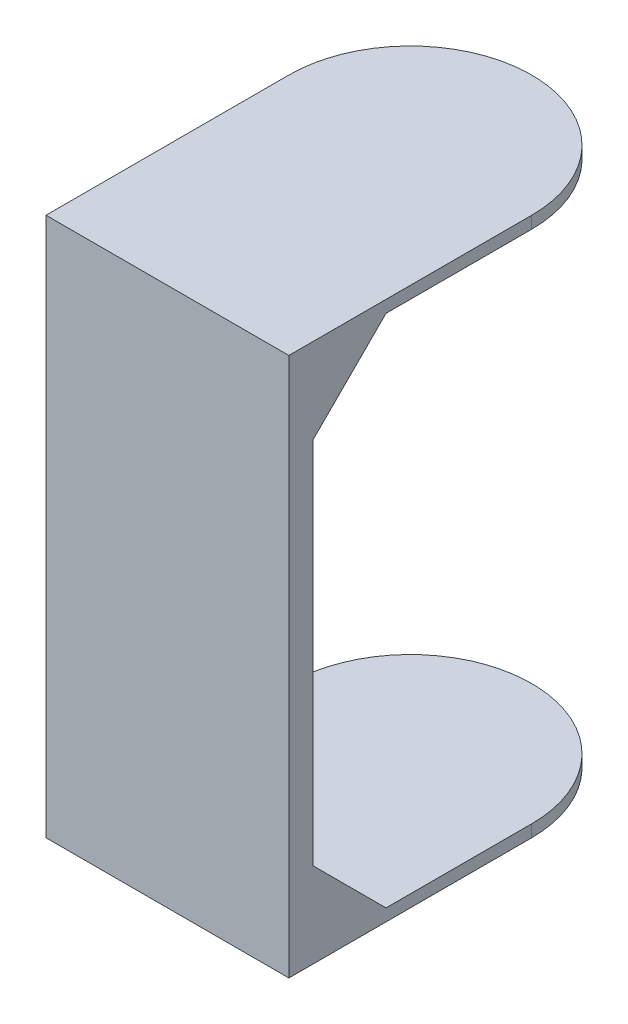
ISO-10303-21;
HEADER;
FILE_DESCRIPTION(('STEP AP214'),'2;1');
FILE_NAME('part.step','',(''),(''),'','','');
FILE_SCHEMA(('AUTOMOTIVE_DESIGN { 1 0 10303 214 1 1 1 1 }'));
ENDSEC;
DATA;
#1=APPLICATION_CONTEXT('core data for automotive mechanical design processes');
#2=APPLICATION_PROTOCOL_DEFINITION('international standard','automotive_design',2000,#1);
#3=PRODUCT_CONTEXT('',#1,'mechanical');
#4=PRODUCT('Part','Part','',(#3));
#5=PRODUCT_RELATED_PRODUCT_CATEGORY('part','',(#4));
#6=PRODUCT_DEFINITION_FORMATION('','',#4);
#7=PRODUCT_DEFINITION_CONTEXT('part definition',#1,'design');
#8=PRODUCT_DEFINITION('design','',#6,#7);
#9=PRODUCT_DEFINITION_SHAPE('','',#8);
#10=(LENGTH_UNIT() NAMED_UNIT(*) SI_UNIT(.MILLI.,.METRE.));
#11=(NAMED_UNIT(*) PLANE_ANGLE_UNIT() SI_UNIT($,.RADIAN.));
#12=(NAMED_UNIT(*) SI_UNIT($,.STERADIAN.) SOLID_ANGLE_UNIT());
#13=UNCERTAINTY_MEASURE_WITH_UNIT(LENGTH_MEASURE(1.E-05),#10,'distance_accuracy_value','');
#14=(GEOMETRIC_REPRESENTATION_CONTEXT(3) GLOBAL_UNCERTAINTY_ASSIGNED_CONTEXT((#13)) GLOBAL_UNIT_ASSIGNED_CONTEXT((#10,
#11,#12)) REPRESENTATION_CONTEXT('',''));
#15=CARTESIAN_POINT('',(0.,0.,0.));
#16=DIRECTION('',(0.,0.,1.));
#17=DIRECTION('',(1.,0.,0.));
#18=AXIS2_PLACEMENT_3D('',#15,#16,#17);
#19=CARTESIAN_POINT('',(0.,0.,-10.));
#20=DIRECTION('',(0.,0.,1.));
#21=DIRECTION('',(1.,0.,0.));
#22=AXIS2_PLACEMENT_3D('',#19,#20,#21);
#23=PLANE('',#22);
#24=DIRECTION('',(0.,-1.,0.));
#25=VECTOR('',#24,1.);
#26=CARTESIAN_POINT('',(-50.,106.,-10.));
#27=LINE('',#26,#25);
#28=CARTESIAN_POINT('',(-50.,76.,-10.));
#29=VERTEX_POINT('',#28);
#30=CARTESIAN_POINT('',(-50.,-106.,-10.));
#31=VERTEX_POINT('',#30);
#32=EDGE_CURVE('E41',#29,#31,#27,.T.);
#33=ORIENTED_EDGE('',*,*,#32,.F.);
#34=DIRECTION('',(-1.,0.,0.));
#35=VECTOR('',#34,1.);
#36=CARTESIAN_POINT('',(-40.,76.,-10.));
#37=LINE('',#36,#35);
#38=CARTESIAN_POINT('',(-40.,76.,-10.));
#39=VERTEX_POINT('',#38);
#40=EDGE_CURVE('E207',#39,#29,#37,.T.);
#41=ORIENTED_EDGE('',*,*,#40,.F.);
#42=DIRECTION('',(0.,1.,0.));
#43=VECTOR('',#42,1.);
#44=CARTESIAN_POINT('',(-40.,106.,-10.));
#45=LINE('',#44,#43);
#46=CARTESIAN_POINT('',(-40.,106.,-10.));
#47=VERTEX_POINT('',#46);
#48=EDGE_CURVE('E195',#39,#47,#45,.T.);
#49=ORIENTED_EDGE('',*,*,#48,.T.);
#50=DIRECTION('',(-1.,0.,0.));
#51=VECTOR('',#50,1.);
#52=CARTESIAN_POINT('',(-50.,106.,-10.));
#53=LINE('',#52,#51);
#54=CARTESIAN_POINT('',(40.,106.,-10.));
#55=VERTEX_POINT('',#54);
#56=EDGE_CURVE('E240',#55,#47,#53,.T.);
#57=ORIENTED_EDGE('',*,*,#56,.F.);
#58=DIRECTION('',(0.,-1.,0.));
#59=VECTOR('',#58,1.);
#60=CARTESIAN_POINT('',(40.,106.,-10.));
#61=LINE('',#60,#59);
#62=CARTESIAN_POINT('',(40.,76.,-10.));
#63=VERTEX_POINT('',#62);
#64=EDGE_CURVE('E227',#55,#63,#61,.T.);
#65=ORIENTED_EDGE('',*,*,#64,.T.);
#66=DIRECTION('',(1.,0.,0.));
#67=VECTOR('',#66,1.);
#68=CARTESIAN_POINT('',(40.,76.,-10.));
#69=LINE('',#68,#67);
#70=CARTESIAN_POINT('',(50.,76.,-10.));
#71=VERTEX_POINT('',#70);
#72=EDGE_CURVE('E233',#63,#71,#69,.T.);
#73=ORIENTED_EDGE('',*,*,#72,.T.);
#74=DIRECTION('',(0.,1.,0.));
#75=VECTOR('',#74,1.);
#76=CARTESIAN_POINT('',(50.,106.,-10.));
#77=LINE('',#76,#75);
#78=CARTESIAN_POINT('',(50.,-76.,-10.));
#79=VERTEX_POINT('',#78);
#80=EDGE_CURVE('E54',#79,#71,#77,.T.);
#81=ORIENTED_EDGE('',*,*,#80,.F.);
#82=DIRECTION('',(1.,0.,0.));
#83=VECTOR('',#82,1.);
#84=CARTESIAN_POINT('',(40.,-76.,-10.));
#85=LINE('',#84,#83);
#86=CARTESIAN_POINT('',(40.,-76.,-10.));
#87=VERTEX_POINT('',#86);
#88=EDGE_CURVE('E219',#87,#79,#85,.T.);
#89=ORIENTED_EDGE('',*,*,#88,.F.);
#90=DIRECTION('',(0.,1.,0.));
#91=VECTOR('',#90,1.);
#92=CARTESIAN_POINT('',(40.,-106.,-10.));
#93=LINE('',#92,#91);
#94=CARTESIAN_POINT('',(40.,-106.,-10.));
#95=VERTEX_POINT('',#94);
#96=EDGE_CURVE('E215',#95,#87,#93,.T.);
#97=ORIENTED_EDGE('',*,*,#96,.F.);
#98=DIRECTION('',(1.,0.,0.));
#99=VECTOR('',#98,1.);
#100=CARTESIAN_POINT('',(-50.,-106.,-10.));
#101=LINE('',#100,#99);
#102=EDGE_CURVE('E11',#31,#95,#101,.T.);
#103=ORIENTED_EDGE('',*,*,#102,.F.);
#104=EDGE_LOOP('',(#33,#41,#49,#57,#65,#73,#81,#89,#97,#103));
#105=FACE_BOUND('',#104,.T.);
#106=ADVANCED_FACE('F32',(#105),#23,.F.);
#107=CARTESIAN_POINT('',(50.,106.,-10.));
#108=DIRECTION('',(1.,0.,0.));
#109=DIRECTION('',(0.,1.,0.));
#110=AXIS2_PLACEMENT_3D('',#107,#108,#109);
#111=PLANE('',#110);
#112=DIRECTION('',(0.,1.,0.));
#113=VECTOR('',#112,1.);
#114=CARTESIAN_POINT('',(50.,106.,0.));
#115=LINE('',#114,#113);
#116=CARTESIAN_POINT('',(50.,-111.,0.));
#117=VERTEX_POINT('',#116);
#118=CARTESIAN_POINT('',(50.,111.,0.));
#119=VERTEX_POINT('',#118);
#120=EDGE_CURVE('E158',#117,#119,#115,.T.);
#121=ORIENTED_EDGE('',*,*,#120,.F.);
#122=DIRECTION('',(0.,0.,-1.));
#123=VECTOR('',#122,1.);
#124=CARTESIAN_POINT('',(50.,-111.,0.));
#125=LINE('',#124,#123);
#126=CARTESIAN_POINT('',(50.,-111.,-100.));
#127=VERTEX_POINT('',#126);
#128=EDGE_CURVE('E151',#117,#127,#125,.T.);
#129=ORIENTED_EDGE('',*,*,#128,.T.);
#130=DIRECTION('',(0.,1.,0.));
#131=VECTOR('',#130,1.);
#132=CARTESIAN_POINT('',(50.,-111.,-100.));
#133=LINE('',#132,#131);
#134=CARTESIAN_POINT('',(50.,-106.,-100.));
#135=VERTEX_POINT('',#134);
#136=EDGE_CURVE('E136',#127,#135,#133,.T.);
#137=ORIENTED_EDGE('',*,*,#136,.T.);
#138=DIRECTION('',(0.,0.,-1.));
#139=VECTOR('',#138,1.);
#140=CARTESIAN_POINT('',(50.,-106.,0.));
#141=LINE('',#140,#139);
#142=CARTESIAN_POINT('',(50.,-106.,-40.));
#143=VERTEX_POINT('',#142);
#144=EDGE_CURVE('E165',#143,#135,#141,.T.);
#145=ORIENTED_EDGE('',*,*,#144,.F.);
#146=DIRECTION('',(0.,-0.707106781186548,-0.707106781186547));
#147=VECTOR('',#146,1.);
#148=CARTESIAN_POINT('',(50.,-76.,-10.));
#149=LINE('',#148,#147);
#150=EDGE_CURVE('E49',#79,#143,#149,.T.);
#151=ORIENTED_EDGE('',*,*,#150,.F.);
#152=ORIENTED_EDGE('',*,*,#80,.T.);
#153=DIRECTION('',(0.,0.707106781186548,-0.707106781186547));
#154=VECTOR('',#153,1.);
#155=CARTESIAN_POINT('',(50.,76.,-10.));
#156=LINE('',#155,#154);
#157=CARTESIAN_POINT('',(50.,106.,-40.));
#158=VERTEX_POINT('',#157);
#159=EDGE_CURVE('E221',#71,#158,#156,.T.);
#160=ORIENTED_EDGE('',*,*,#159,.T.);
#161=DIRECTION('',(0.,0.,-1.));
#162=VECTOR('',#161,1.);
#163=CARTESIAN_POINT('',(50.,106.,0.));
#164=LINE('',#163,#162);
#165=CARTESIAN_POINT('',(50.,106.,-100.));
#166=VERTEX_POINT('',#165);
#167=EDGE_CURVE('E174',#158,#166,#164,.T.);
#168=ORIENTED_EDGE('',*,*,#167,.T.);
#169=DIRECTION('',(0.,-1.,0.));
#170=VECTOR('',#169,1.);
#171=CARTESIAN_POINT('',(50.,111.,-100.));
#172=LINE('',#171,#170);
#173=CARTESIAN_POINT('',(50.,111.,-100.));
#174=VERTEX_POINT('',#173);
#175=EDGE_CURVE('E182',#174,#166,#172,.T.);
#176=ORIENTED_EDGE('',*,*,#175,.F.);
#177=DIRECTION('',(0.,0.,-1.));
#178=VECTOR('',#177,1.);
#179=CARTESIAN_POINT('',(50.,111.,0.));
#180=LINE('',#179,#178);
#181=EDGE_CURVE('E180',#119,#174,#180,.T.);
#182=ORIENTED_EDGE('',*,*,#181,.F.);
#183=EDGE_LOOP('',(#121,#129,#137,#145,#151,#152,#160,#168,#176,#182));
#184=FACE_BOUND('',#183,.T.);
#185=ADVANCED_FACE('F34',(#184),#111,.T.);
#186=CARTESIAN_POINT('',(-50.,106.,-10.));
#187=DIRECTION('',(-1.,0.,0.));
#188=DIRECTION('',(0.,-1.,0.));
#189=AXIS2_PLACEMENT_3D('',#186,#187,#188);
#190=PLANE('',#189);
#191=DIRECTION('',(0.,-1.,0.));
#192=VECTOR('',#191,1.);
#193=CARTESIAN_POINT('',(-50.,106.,0.));
#194=LINE('',#193,#192);
#195=CARTESIAN_POINT('',(-50.,111.,0.));
#196=VERTEX_POINT('',#195);
#197=CARTESIAN_POINT('',(-50.,-111.,0.));
#198=VERTEX_POINT('',#197);
#199=EDGE_CURVE('E36',#196,#198,#194,.T.);
#200=ORIENTED_EDGE('',*,*,#199,.F.);
#201=DIRECTION('',(0.,0.,1.));
#202=VECTOR('',#201,1.);
#203=CARTESIAN_POINT('',(-50.,111.,0.));
#204=LINE('',#203,#202);
#205=CARTESIAN_POINT('',(-50.,111.,-100.));
#206=VERTEX_POINT('',#205);
#207=EDGE_CURVE('E173',#206,#196,#204,.T.);
#208=ORIENTED_EDGE('',*,*,#207,.F.);
#209=DIRECTION('',(0.,-1.,0.));
#210=VECTOR('',#209,1.);
#211=CARTESIAN_POINT('',(-50.,111.,-100.));
#212=LINE('',#211,#210);
#213=CARTESIAN_POINT('',(-50.,106.,-100.));
#214=VERTEX_POINT('',#213);
#215=EDGE_CURVE('E191',#206,#214,#212,.T.);
#216=ORIENTED_EDGE('',*,*,#215,.T.);
#217=DIRECTION('',(0.,0.,1.));
#218=VECTOR('',#217,1.);
#219=CARTESIAN_POINT('',(-50.,106.,0.));
#220=LINE('',#219,#218);
#221=CARTESIAN_POINT('',(-50.,106.,-40.));
#222=VERTEX_POINT('',#221);
#223=EDGE_CURVE('E185',#214,#222,#220,.T.);
#224=ORIENTED_EDGE('',*,*,#223,.T.);
#225=DIRECTION('',(0.,-0.707106781186548,0.707106781186547));
#226=VECTOR('',#225,1.);
#227=CARTESIAN_POINT('',(-50.,76.,-10.));
#228=LINE('',#227,#226);
#229=EDGE_CURVE('E194',#222,#29,#228,.T.);
#230=ORIENTED_EDGE('',*,*,#229,.T.);
#231=ORIENTED_EDGE('',*,*,#32,.T.);
#232=DIRECTION('',(0.,0.,1.));
#233=VECTOR('',#232,1.);
#234=CARTESIAN_POINT('',(-50.,-106.,0.));
#235=LINE('',#234,#233);
#236=CARTESIAN_POINT('',(-50.,-106.,-100.));
#237=VERTEX_POINT('',#236);
#238=EDGE_CURVE('E155',#237,#31,#235,.T.);
#239=ORIENTED_EDGE('',*,*,#238,.F.);
#240=DIRECTION('',(0.,1.,0.));
#241=VECTOR('',#240,1.);
#242=CARTESIAN_POINT('',(-50.,-111.,-100.));
#243=LINE('',#242,#241);
#244=CARTESIAN_POINT('',(-50.,-111.,-100.));
#245=VERTEX_POINT('',#244);
#246=EDGE_CURVE('E145',#245,#237,#243,.T.);
#247=ORIENTED_EDGE('',*,*,#246,.F.);
#248=DIRECTION('',(0.,0.,1.));
#249=VECTOR('',#248,1.);
#250=CARTESIAN_POINT('',(-50.,-111.,0.));
#251=LINE('',#250,#249);
#252=EDGE_CURVE('E154',#245,#198,#251,.T.);
#253=ORIENTED_EDGE('',*,*,#252,.T.);
#254=EDGE_LOOP('',(#200,#208,#216,#224,#230,#231,#239,#247,#253));
#255=FACE_BOUND('',#254,.T.);
#256=ADVANCED_FACE('F247',(#255),#190,.T.);
#257=CARTESIAN_POINT('',(0.,0.,0.));
#258=DIRECTION('',(0.,0.,1.));
#259=DIRECTION('',(1.,0.,0.));
#260=AXIS2_PLACEMENT_3D('',#257,#258,#259);
#261=PLANE('',#260);
#262=ORIENTED_EDGE('',*,*,#120,.T.);
#263=DIRECTION('',(1.,0.,0.));
#264=VECTOR('',#263,1.);
#265=CARTESIAN_POINT('',(-50.,111.,0.));
#266=LINE('',#265,#264);
#267=EDGE_CURVE('E177',#196,#119,#266,.T.);
#268=ORIENTED_EDGE('',*,*,#267,.F.);
#269=ORIENTED_EDGE('',*,*,#199,.T.);
#270=DIRECTION('',(1.,0.,0.));
#271=VECTOR('',#270,1.);
#272=CARTESIAN_POINT('',(-50.,-111.,0.));
#273=LINE('',#272,#271);
#274=EDGE_CURVE('E159',#198,#117,#273,.T.);
#275=ORIENTED_EDGE('',*,*,#274,.T.);
#276=EDGE_LOOP('',(#262,#268,#269,#275));
#277=FACE_BOUND('',#276,.T.);
#278=ADVANCED_FACE('F245',(#277),#261,.T.);
#279=CARTESIAN_POINT('',(40.,76.,-10.));
#280=DIRECTION('',(0.,-0.707106781186547,-0.707106781186548));
#281=DIRECTION('',(0.,0.707106781186548,-0.707106781186547));
#282=AXIS2_PLACEMENT_3D('',#279,#280,#281);
#283=PLANE('',#282);
#284=ORIENTED_EDGE('',*,*,#159,.F.);
#285=ORIENTED_EDGE('',*,*,#72,.F.);
#286=DIRECTION('',(0.,0.707106781186548,-0.707106781186547));
#287=VECTOR('',#286,1.);
#288=CARTESIAN_POINT('',(40.,76.,-10.));
#289=LINE('',#288,#287);
#290=CARTESIAN_POINT('',(40.,106.,-40.));
#291=VERTEX_POINT('',#290);
#292=EDGE_CURVE('E230',#63,#291,#289,.T.);
#293=ORIENTED_EDGE('',*,*,#292,.T.);
#294=DIRECTION('',(1.,0.,0.));
#295=VECTOR('',#294,1.);
#296=CARTESIAN_POINT('',(40.,106.,-40.));
#297=LINE('',#296,#295);
#298=EDGE_CURVE('E235',#291,#158,#297,.T.);
#299=ORIENTED_EDGE('',*,*,#298,.T.);
#300=EDGE_LOOP('',(#284,#285,#293,#299));
#301=FACE_BOUND('',#300,.T.);
#302=ADVANCED_FACE('F263',(#301),#283,.T.);
#303=CARTESIAN_POINT('',(40.,0.,0.));
#304=DIRECTION('',(1.,0.,0.));
#305=DIRECTION('',(0.,0.,-1.));
#306=AXIS2_PLACEMENT_3D('',#303,#304,#305);
#307=PLANE('',#306);
#308=DIRECTION('',(0.,0.,1.));
#309=VECTOR('',#308,1.);
#310=CARTESIAN_POINT('',(40.,106.,-40.));
#311=LINE('',#310,#309);
#312=EDGE_CURVE('E224',#291,#55,#311,.T.);
#313=ORIENTED_EDGE('',*,*,#312,.F.);
#314=ORIENTED_EDGE('',*,*,#292,.F.);
#315=ORIENTED_EDGE('',*,*,#64,.F.);
#316=EDGE_LOOP('',(#313,#314,#315));
#317=FACE_BOUND('',#316,.T.);
#318=ADVANCED_FACE('F266',(#317),#307,.F.);
#319=CARTESIAN_POINT('',(40.,-76.,-10.));
#320=DIRECTION('',(0.,-0.707106781186547,0.707106781186548));
#321=DIRECTION('',(0.,-0.707106781186548,-0.707106781186547));
#322=AXIS2_PLACEMENT_3D('',#319,#320,#321);
#323=PLANE('',#322);
#324=ORIENTED_EDGE('',*,*,#150,.T.);
#325=DIRECTION('',(1.,0.,0.));
#326=VECTOR('',#325,1.);
#327=CARTESIAN_POINT('',(40.,-106.,-40.));
#328=LINE('',#327,#326);
#329=CARTESIAN_POINT('',(40.,-106.,-40.));
#330=VERTEX_POINT('',#329);
#331=EDGE_CURVE('E217',#330,#143,#328,.T.);
#332=ORIENTED_EDGE('',*,*,#331,.F.);
#333=DIRECTION('',(0.,-0.707106781186548,-0.707106781186547));
#334=VECTOR('',#333,1.);
#335=CARTESIAN_POINT('',(40.,-76.,-10.));
#336=LINE('',#335,#334);
#337=EDGE_CURVE('E213',#87,#330,#336,.T.);
#338=ORIENTED_EDGE('',*,*,#337,.F.);
#339=ORIENTED_EDGE('',*,*,#88,.T.);
#340=EDGE_LOOP('',(#324,#332,#338,#339));
#341=FACE_BOUND('',#340,.T.);
#342=ADVANCED_FACE('F255',(#341),#323,.F.);
#343=CARTESIAN_POINT('',(40.,0.,0.));
#344=DIRECTION('',(1.,0.,0.));
#345=DIRECTION('',(0.,0.,-1.));
#346=AXIS2_PLACEMENT_3D('',#343,#344,#345);
#347=PLANE('',#346);
#348=DIRECTION('',(0.,0.,1.));
#349=VECTOR('',#348,1.);
#350=CARTESIAN_POINT('',(40.,-106.,-40.));
#351=LINE('',#350,#349);
#352=EDGE_CURVE('E211',#330,#95,#351,.T.);
#353=ORIENTED_EDGE('',*,*,#352,.T.);
#354=ORIENTED_EDGE('',*,*,#96,.T.);
#355=ORIENTED_EDGE('',*,*,#337,.T.);
#356=EDGE_LOOP('',(#353,#354,#355));
#357=FACE_BOUND('',#356,.T.);
#358=ADVANCED_FACE('F323',(#357),#347,.F.);
#359=CARTESIAN_POINT('',(-40.,76.,-10.));
#360=DIRECTION('',(0.,-0.707106781186547,-0.707106781186548));
#361=DIRECTION('',(0.,0.707106781186548,-0.707106781186547));
#362=AXIS2_PLACEMENT_3D('',#359,#360,#361);
#363=PLANE('',#362);
#364=ORIENTED_EDGE('',*,*,#229,.F.);
#365=DIRECTION('',(-1.,0.,0.));
#366=VECTOR('',#365,1.);
#367=CARTESIAN_POINT('',(-40.,106.,-40.));
#368=LINE('',#367,#366);
#369=CARTESIAN_POINT('',(-40.,106.,-40.));
#370=VERTEX_POINT('',#369);
#371=EDGE_CURVE('E204',#370,#222,#368,.T.);
#372=ORIENTED_EDGE('',*,*,#371,.F.);
#373=DIRECTION('',(0.,-0.707106781186548,0.707106781186547));
#374=VECTOR('',#373,1.);
#375=CARTESIAN_POINT('',(-40.,76.,-10.));
#376=LINE('',#375,#374);
#377=EDGE_CURVE('E201',#370,#39,#376,.T.);
#378=ORIENTED_EDGE('',*,*,#377,.T.);
#379=ORIENTED_EDGE('',*,*,#40,.T.);
#380=EDGE_LOOP('',(#364,#372,#378,#379));
#381=FACE_BOUND('',#380,.T.);
#382=ADVANCED_FACE('F330',(#381),#363,.T.);
#383=CARTESIAN_POINT('',(-40.,0.,0.));
#384=DIRECTION('',(-1.,0.,0.));
#385=DIRECTION('',(0.,-1.,0.));
#386=AXIS2_PLACEMENT_3D('',#383,#384,#385);
#387=PLANE('',#386);
#388=ORIENTED_EDGE('',*,*,#48,.F.);
#389=ORIENTED_EDGE('',*,*,#377,.F.);
#390=DIRECTION('',(0.,0.,-1.));
#391=VECTOR('',#390,1.);
#392=CARTESIAN_POINT('',(-40.,106.,-40.));
#393=LINE('',#392,#391);
#394=EDGE_CURVE('E198',#47,#370,#393,.T.);
#395=ORIENTED_EDGE('',*,*,#394,.F.);
#396=EDGE_LOOP('',(#388,#389,#395));
#397=FACE_BOUND('',#396,.T.);
#398=ADVANCED_FACE('F285',(#397),#387,.F.);
#399=CARTESIAN_POINT('',(0.,111.,-100.));
#400=DIRECTION('',(0.,-1.,0.));
#401=DIRECTION('',(0.,0.,-1.));
#402=AXIS2_PLACEMENT_3D('',#399,#400,#401);
#403=CYLINDRICAL_SURFACE('',#402,50.);
#404=CARTESIAN_POINT('',(0.,106.,-100.));
#405=DIRECTION('',(0.,1.,0.));
#406=DIRECTION('',(0.,0.,1.));
#407=AXIS2_PLACEMENT_3D('',#404,#405,#406);
#408=CIRCLE('',#407,50.);
#409=EDGE_CURVE('E144',#166,#214,#408,.T.);
#410=ORIENTED_EDGE('',*,*,#409,.T.);
#411=ORIENTED_EDGE('',*,*,#215,.F.);
#412=CARTESIAN_POINT('',(0.,111.,-100.));
#413=DIRECTION('',(0.,1.,0.));
#414=DIRECTION('',(0.,0.,1.));
#415=AXIS2_PLACEMENT_3D('',#412,#413,#414);
#416=CIRCLE('',#415,50.);
#417=EDGE_CURVE('E170',#174,#206,#416,.T.);
#418=ORIENTED_EDGE('',*,*,#417,.F.);
#419=ORIENTED_EDGE('',*,*,#175,.T.);
#420=EDGE_LOOP('',(#410,#411,#418,#419));
#421=FACE_BOUND('',#420,.T.);
#422=ADVANCED_FACE('F274',(#421),#403,.T.);
#423=CARTESIAN_POINT('',(0.,111.,-100.));
#424=DIRECTION('',(0.,1.,0.));
#425=DIRECTION('',(0.,0.,1.));
#426=AXIS2_PLACEMENT_3D('',#423,#424,#425);
#427=PLANE('',#426);
#428=ORIENTED_EDGE('',*,*,#417,.T.);
#429=ORIENTED_EDGE('',*,*,#207,.T.);
#430=ORIENTED_EDGE('',*,*,#267,.T.);
#431=ORIENTED_EDGE('',*,*,#181,.T.);
#432=EDGE_LOOP('',(#428,#429,#430,#431));
#433=FACE_BOUND('',#432,.T.);
#434=ADVANCED_FACE('F277',(#433),#427,.T.);
#435=CARTESIAN_POINT('',(0.,106.,-100.));
#436=DIRECTION('',(0.,1.,0.));
#437=DIRECTION('',(0.,0.,1.));
#438=AXIS2_PLACEMENT_3D('',#435,#436,#437);
#439=PLANE('',#438);
#440=ORIENTED_EDGE('',*,*,#298,.F.);
#441=ORIENTED_EDGE('',*,*,#312,.T.);
#442=ORIENTED_EDGE('',*,*,#56,.T.);
#443=ORIENTED_EDGE('',*,*,#394,.T.);
#444=ORIENTED_EDGE('',*,*,#371,.T.);
#445=ORIENTED_EDGE('',*,*,#223,.F.);
#446=ORIENTED_EDGE('',*,*,#409,.F.);
#447=ORIENTED_EDGE('',*,*,#167,.F.);
#448=EDGE_LOOP('',(#440,#441,#442,#443,#444,#445,#446,#447));
#449=FACE_BOUND('',#448,.T.);
#450=ADVANCED_FACE('F268',(#449),#439,.F.);
#451=CARTESIAN_POINT('',(0.,-106.,-100.));
#452=DIRECTION('',(0.,-1.,0.));
#453=DIRECTION('',(0.,0.,1.));
#454=AXIS2_PLACEMENT_3D('',#451,#452,#453);
#455=PLANE('',#454);
#456=ORIENTED_EDGE('',*,*,#238,.T.);
#457=ORIENTED_EDGE('',*,*,#102,.T.);
#458=ORIENTED_EDGE('',*,*,#352,.F.);
#459=ORIENTED_EDGE('',*,*,#331,.T.);
#460=ORIENTED_EDGE('',*,*,#144,.T.);
#461=CARTESIAN_POINT('',(0.,-106.,-100.));
#462=DIRECTION('',(0.,1.,0.));
#463=DIRECTION('',(0.,0.,1.));
#464=AXIS2_PLACEMENT_3D('',#461,#462,#463);
#465=CIRCLE('',#464,50.);
#466=EDGE_CURVE('E142',#135,#237,#465,.T.);
#467=ORIENTED_EDGE('',*,*,#466,.T.);
#468=EDGE_LOOP('',(#456,#457,#458,#459,#460,#467));
#469=FACE_BOUND('',#468,.T.);
#470=ADVANCED_FACE('F250',(#469),#455,.F.);
#471=CARTESIAN_POINT('',(0.,-111.,-100.));
#472=DIRECTION('',(0.,1.,0.));
#473=DIRECTION('',(0.,0.,1.));
#474=AXIS2_PLACEMENT_3D('',#471,#472,#473);
#475=CYLINDRICAL_SURFACE('',#474,50.);
#476=ORIENTED_EDGE('',*,*,#466,.F.);
#477=ORIENTED_EDGE('',*,*,#136,.F.);
#478=CARTESIAN_POINT('',(0.,-111.,-100.));
#479=DIRECTION('',(0.,1.,0.));
#480=DIRECTION('',(0.,0.,1.));
#481=AXIS2_PLACEMENT_3D('',#478,#479,#480);
#482=CIRCLE('',#481,50.);
#483=EDGE_CURVE('E139',#127,#245,#482,.T.);
#484=ORIENTED_EDGE('',*,*,#483,.T.);
#485=ORIENTED_EDGE('',*,*,#246,.T.);
#486=EDGE_LOOP('',(#476,#477,#484,#485));
#487=FACE_BOUND('',#486,.T.);
#488=ADVANCED_FACE('F138',(#487),#475,.T.);
#489=CARTESIAN_POINT('',(0.,-111.,-100.));
#490=DIRECTION('',(0.,-1.,0.));
#491=DIRECTION('',(0.,0.,1.));
#492=AXIS2_PLACEMENT_3D('',#489,#490,#491);
#493=PLANE('',#492);
#494=ORIENTED_EDGE('',*,*,#483,.F.);
#495=ORIENTED_EDGE('',*,*,#128,.F.);
#496=ORIENTED_EDGE('',*,*,#274,.F.);
#497=ORIENTED_EDGE('',*,*,#252,.F.);
#498=EDGE_LOOP('',(#494,#495,#496,#497));
#499=FACE_BOUND('',#498,.T.);
#500=ADVANCED_FACE('F149',(#499),#493,.T.);
#501=CLOSED_SHELL('',(#106,#185,#256,#278,#302,#318,#342,#358,#382,#398,#422,#434,#450,#470,
#488,#500));
#502=MANIFOLD_SOLID_BREP('B2',#501);
#503=ADVANCED_BREP_SHAPE_REPRESENTATION('',(#18,#502),#14);
#504=SHAPE_DEFINITION_REPRESENTATION(#9,#503);
ENDSEC;
END-ISO-10303-21;
